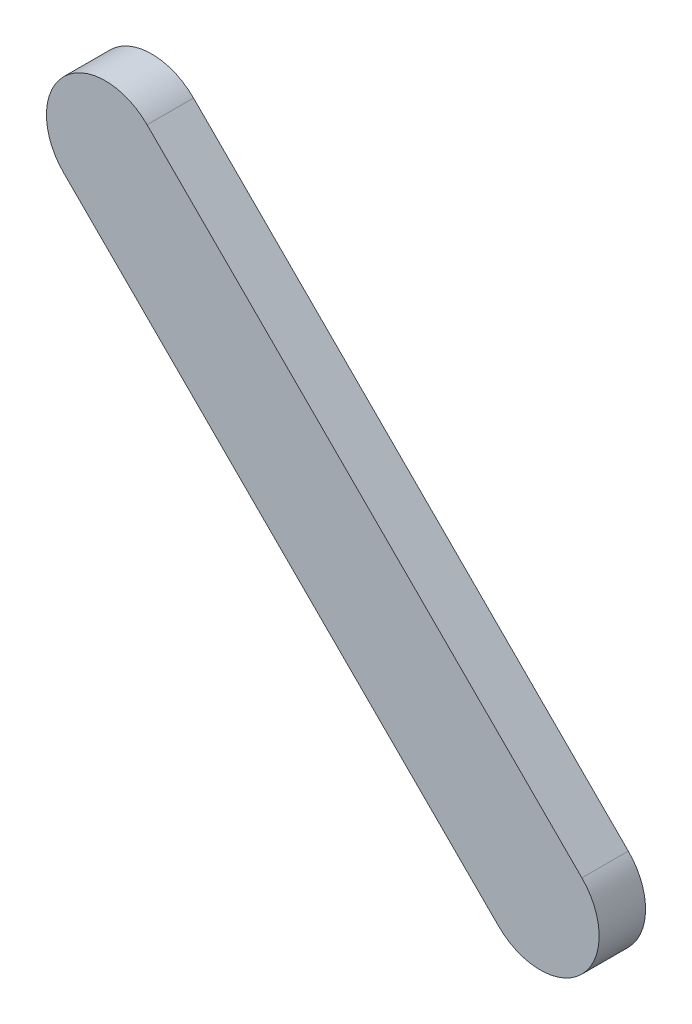
ISO-10303-21;
HEADER;
FILE_DESCRIPTION(('STEP AP214'),'2;1');
FILE_NAME('part.step','',(''),(''),'','','');
FILE_SCHEMA(('AUTOMOTIVE_DESIGN { 1 0 10303 214 1 1 1 1 }'));
ENDSEC;
DATA;
#1=APPLICATION_CONTEXT('core data for automotive mechanical design processes');
#2=APPLICATION_PROTOCOL_DEFINITION('international standard','automotive_design',2000,#1);
#3=PRODUCT_CONTEXT('',#1,'mechanical');
#4=PRODUCT('Part','Part','',(#3));
#5=PRODUCT_RELATED_PRODUCT_CATEGORY('part','',(#4));
#6=PRODUCT_DEFINITION_FORMATION('','',#4);
#7=PRODUCT_DEFINITION_CONTEXT('part definition',#1,'design');
#8=PRODUCT_DEFINITION('design','',#6,#7);
#9=PRODUCT_DEFINITION_SHAPE('','',#8);
#10=(LENGTH_UNIT() NAMED_UNIT(*) SI_UNIT(.MILLI.,.METRE.));
#11=(NAMED_UNIT(*) PLANE_ANGLE_UNIT() SI_UNIT($,.RADIAN.));
#12=(NAMED_UNIT(*) SI_UNIT($,.STERADIAN.) SOLID_ANGLE_UNIT());
#13=UNCERTAINTY_MEASURE_WITH_UNIT(LENGTH_MEASURE(1.E-05),#10,'distance_accuracy_value','');
#14=(GEOMETRIC_REPRESENTATION_CONTEXT(3) GLOBAL_UNCERTAINTY_ASSIGNED_CONTEXT((#13)) GLOBAL_UNIT_ASSIGNED_CONTEXT((#10,
#11,#12)) REPRESENTATION_CONTEXT('',''));
#15=CARTESIAN_POINT('',(0.,0.,0.));
#16=DIRECTION('',(0.,0.,1.));
#17=DIRECTION('',(1.,0.,0.));
#18=AXIS2_PLACEMENT_3D('',#15,#16,#17);
#19=CARTESIAN_POINT('',(136.21839406,106.2463966,0.));
#20=DIRECTION('',(0.707106781186542,0.707106781186553,0.));
#21=DIRECTION('',(0.707106781186553,-0.707106781186542,0.));
#22=AXIS2_PLACEMENT_3D('',#19,#20,#21);
#23=PLANE('',#22);
#24=DIRECTION('',(0.707106781186553,-0.707106781186542,0.));
#25=VECTOR('',#24,1.);
#26=CARTESIAN_POINT('',(136.21839406,106.2463966,0.1999996));
#27=LINE('',#26,#25);
#28=CARTESIAN_POINT('',(136.21839406,106.2463966,0.1999996));
#29=VERTEX_POINT('',#28);
#30=CARTESIAN_POINT('',(138.09184726,104.3729434,0.1999996));
#31=VERTEX_POINT('',#30);
#32=EDGE_CURVE('E11',#29,#31,#27,.T.);
#33=ORIENTED_EDGE('',*,*,#32,.F.);
#34=DIRECTION('',(0.,0.,1.));
#35=VECTOR('',#34,1.);
#36=CARTESIAN_POINT('',(136.21839406,106.2463966,0.));
#37=LINE('',#36,#35);
#38=CARTESIAN_POINT('',(136.21839406,106.2463966,0.));
#39=VERTEX_POINT('',#38);
#40=EDGE_CURVE('E24',#39,#29,#37,.T.);
#41=ORIENTED_EDGE('',*,*,#40,.F.);
#42=DIRECTION('',(0.707106781186553,-0.707106781186542,0.));
#43=VECTOR('',#42,1.);
#44=CARTESIAN_POINT('',(136.21839406,106.2463966,0.));
#45=LINE('',#44,#43);
#46=CARTESIAN_POINT('',(138.09184726,104.3729434,0.));
#47=VERTEX_POINT('',#46);
#48=EDGE_CURVE('E75',#39,#47,#45,.T.);
#49=ORIENTED_EDGE('',*,*,#48,.T.);
#50=DIRECTION('',(0.,0.,1.));
#51=VECTOR('',#50,1.);
#52=CARTESIAN_POINT('',(138.09184726,104.3729434,0.));
#53=LINE('',#52,#51);
#54=EDGE_CURVE('E37',#47,#31,#53,.T.);
#55=ORIENTED_EDGE('',*,*,#54,.T.);
#56=EDGE_LOOP('',(#33,#41,#49,#55));
#57=FACE_BOUND('',#56,.T.);
#58=ADVANCED_FACE('F17',(#57),#23,.F.);
#59=CARTESIAN_POINT('',(138.2714532,104.55254934,0.));
#60=DIRECTION('',(0.,0.,-1.));
#61=DIRECTION('',(-0.70710678118652,-0.707106781186576,0.));
#62=AXIS2_PLACEMENT_3D('',#59,#60,#61);
#63=CYLINDRICAL_SURFACE('',#62,0.254001156230774);
#64=CARTESIAN_POINT('',(138.2714532,104.55254934,0.1999996));
#65=DIRECTION('',(0.,0.,1.));
#66=DIRECTION('',(-0.70710678118652,-0.707106781186576,0.));
#67=AXIS2_PLACEMENT_3D('',#64,#65,#66);
#68=CIRCLE('',#67,0.254001156230774);
#69=CARTESIAN_POINT('',(138.45105914,104.73215528,0.1999996));
#70=VERTEX_POINT('',#69);
#71=EDGE_CURVE('E83',#31,#70,#68,.T.);
#72=ORIENTED_EDGE('',*,*,#71,.F.);
#73=ORIENTED_EDGE('',*,*,#54,.F.);
#74=CARTESIAN_POINT('',(138.2714532,104.55254934,0.));
#75=DIRECTION('',(0.,0.,1.));
#76=DIRECTION('',(-0.70710678118652,-0.707106781186576,0.));
#77=AXIS2_PLACEMENT_3D('',#74,#75,#76);
#78=CIRCLE('',#77,0.254001156230774);
#79=CARTESIAN_POINT('',(138.45105914,104.73215528,0.));
#80=VERTEX_POINT('',#79);
#81=EDGE_CURVE('E81',#47,#80,#78,.T.);
#82=ORIENTED_EDGE('',*,*,#81,.T.);
#83=DIRECTION('',(0.,0.,1.));
#84=VECTOR('',#83,1.);
#85=CARTESIAN_POINT('',(138.45105914,104.73215528,0.));
#86=LINE('',#85,#84);
#87=EDGE_CURVE('E67',#80,#70,#86,.T.);
#88=ORIENTED_EDGE('',*,*,#87,.T.);
#89=EDGE_LOOP('',(#72,#73,#82,#88));
#90=FACE_BOUND('',#89,.T.);
#91=ADVANCED_FACE('F89',(#90),#63,.T.);
#92=CARTESIAN_POINT('',(138.45105914,104.73215528,0.));
#93=DIRECTION('',(-0.707106781186542,-0.707106781186553,0.));
#94=DIRECTION('',(-0.707106781186553,0.707106781186542,0.));
#95=AXIS2_PLACEMENT_3D('',#92,#93,#94);
#96=PLANE('',#95);
#97=DIRECTION('',(-0.707106781186553,0.707106781186542,0.));
#98=VECTOR('',#97,1.);
#99=CARTESIAN_POINT('',(138.45105914,104.73215528,0.1999996));
#100=LINE('',#99,#98);
#101=CARTESIAN_POINT('',(136.57760594,106.60560848,0.1999996));
#102=VERTEX_POINT('',#101);
#103=EDGE_CURVE('E71',#70,#102,#100,.T.);
#104=ORIENTED_EDGE('',*,*,#103,.F.);
#105=ORIENTED_EDGE('',*,*,#87,.F.);
#106=DIRECTION('',(-0.707106781186553,0.707106781186542,0.));
#107=VECTOR('',#106,1.);
#108=CARTESIAN_POINT('',(138.45105914,104.73215528,0.));
#109=LINE('',#108,#107);
#110=CARTESIAN_POINT('',(136.57760594,106.60560848,0.));
#111=VERTEX_POINT('',#110);
#112=EDGE_CURVE('E63',#80,#111,#109,.T.);
#113=ORIENTED_EDGE('',*,*,#112,.T.);
#114=DIRECTION('',(0.,0.,1.));
#115=VECTOR('',#114,1.);
#116=CARTESIAN_POINT('',(136.57760594,106.60560848,0.));
#117=LINE('',#116,#115);
#118=EDGE_CURVE('E53',#111,#102,#117,.T.);
#119=ORIENTED_EDGE('',*,*,#118,.T.);
#120=EDGE_LOOP('',(#104,#105,#113,#119));
#121=FACE_BOUND('',#120,.T.);
#122=ADVANCED_FACE('F66',(#121),#96,.F.);
#123=CARTESIAN_POINT('',(136.398,106.42600254,0.));
#124=DIRECTION('',(0.,0.,-1.));
#125=DIRECTION('',(0.707106781186576,0.70710678118652,0.));
#126=AXIS2_PLACEMENT_3D('',#123,#124,#125);
#127=CYLINDRICAL_SURFACE('',#126,0.254001156230768);
#128=CARTESIAN_POINT('',(136.398,106.42600254,0.1999996));
#129=DIRECTION('',(0.,0.,1.));
#130=DIRECTION('',(0.707106781186576,0.70710678118652,0.));
#131=AXIS2_PLACEMENT_3D('',#128,#129,#130);
#132=CIRCLE('',#131,0.254001156230768);
#133=EDGE_CURVE('E59',#102,#29,#132,.T.);
#134=ORIENTED_EDGE('',*,*,#133,.F.);
#135=ORIENTED_EDGE('',*,*,#118,.F.);
#136=CARTESIAN_POINT('',(136.398,106.42600254,0.));
#137=DIRECTION('',(0.,0.,1.));
#138=DIRECTION('',(0.707106781186576,0.70710678118652,0.));
#139=AXIS2_PLACEMENT_3D('',#136,#137,#138);
#140=CIRCLE('',#139,0.254001156230768);
#141=EDGE_CURVE('E57',#111,#39,#140,.T.);
#142=ORIENTED_EDGE('',*,*,#141,.T.);
#143=ORIENTED_EDGE('',*,*,#40,.T.);
#144=EDGE_LOOP('',(#134,#135,#142,#143));
#145=FACE_BOUND('',#144,.T.);
#146=ADVANCED_FACE('F55',(#145),#127,.T.);
#147=CARTESIAN_POINT('',(136.21839406,106.2463966,0.));
#148=DIRECTION('',(0.,0.,-1.));
#149=DIRECTION('',(-1.,0.,0.));
#150=AXIS2_PLACEMENT_3D('',#147,#148,#149);
#151=PLANE('',#150);
#152=ORIENTED_EDGE('',*,*,#141,.F.);
#153=ORIENTED_EDGE('',*,*,#112,.F.);
#154=ORIENTED_EDGE('',*,*,#81,.F.);
#155=ORIENTED_EDGE('',*,*,#48,.F.);
#156=EDGE_LOOP('',(#152,#153,#154,#155));
#157=FACE_BOUND('',#156,.T.);
#158=ADVANCED_FACE('F74',(#157),#151,.T.);
#159=CARTESIAN_POINT('',(136.21839406,106.2463966,0.1999996));
#160=DIRECTION('',(0.,0.,-1.));
#161=DIRECTION('',(-1.,0.,0.));
#162=AXIS2_PLACEMENT_3D('',#159,#160,#161);
#163=PLANE('',#162);
#164=ORIENTED_EDGE('',*,*,#32,.T.);
#165=ORIENTED_EDGE('',*,*,#71,.T.);
#166=ORIENTED_EDGE('',*,*,#103,.T.);
#167=ORIENTED_EDGE('',*,*,#133,.T.);
#168=EDGE_LOOP('',(#164,#165,#166,#167));
#169=FACE_BOUND('',#168,.T.);
#170=ADVANCED_FACE('F91',(#169),#163,.F.);
#171=CLOSED_SHELL('',(#58,#91,#122,#146,#158,#170));
#172=MANIFOLD_SOLID_BREP('B1',#171);
#173=ADVANCED_BREP_SHAPE_REPRESENTATION('',(#18,#172),#14);
#174=SHAPE_DEFINITION_REPRESENTATION(#9,#173);
ENDSEC;
END-ISO-10303-21;
